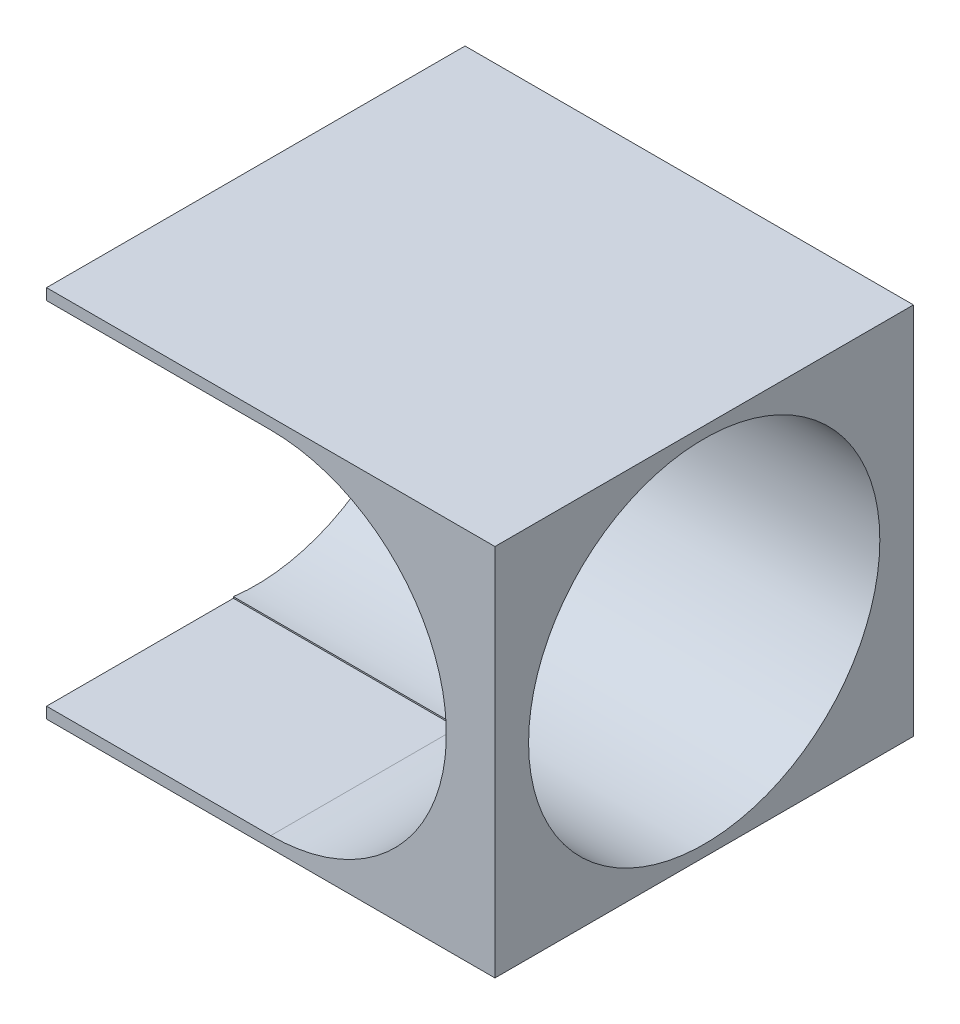
ISO-10303-21;
HEADER;
FILE_DESCRIPTION(('STEP AP214'),'2;1');
FILE_NAME('part.step','',(''),(''),'','','');
FILE_SCHEMA(('AUTOMOTIVE_DESIGN { 1 0 10303 214 1 1 1 1 }'));
ENDSEC;
DATA;
#1=APPLICATION_CONTEXT('core data for automotive mechanical design processes');
#2=APPLICATION_PROTOCOL_DEFINITION('international standard','automotive_design',2000,#1);
#3=PRODUCT_CONTEXT('',#1,'mechanical');
#4=PRODUCT('Part','Part','',(#3));
#5=PRODUCT_RELATED_PRODUCT_CATEGORY('part','',(#4));
#6=PRODUCT_DEFINITION_FORMATION('','',#4);
#7=PRODUCT_DEFINITION_CONTEXT('part definition',#1,'design');
#8=PRODUCT_DEFINITION('design','',#6,#7);
#9=PRODUCT_DEFINITION_SHAPE('','',#8);
#10=(LENGTH_UNIT() NAMED_UNIT(*) SI_UNIT(.MILLI.,.METRE.));
#11=(NAMED_UNIT(*) PLANE_ANGLE_UNIT() SI_UNIT($,.RADIAN.));
#12=(NAMED_UNIT(*) SI_UNIT($,.STERADIAN.) SOLID_ANGLE_UNIT());
#13=UNCERTAINTY_MEASURE_WITH_UNIT(LENGTH_MEASURE(1.E-05),#10,'distance_accuracy_value','');
#14=(GEOMETRIC_REPRESENTATION_CONTEXT(3) GLOBAL_UNCERTAINTY_ASSIGNED_CONTEXT((#13)) GLOBAL_UNIT_ASSIGNED_CONTEXT((#10,
#11,#12)) REPRESENTATION_CONTEXT('',''));
#15=CARTESIAN_POINT('',(0.,0.,0.));
#16=DIRECTION('',(0.,0.,1.));
#17=DIRECTION('',(1.,0.,0.));
#18=AXIS2_PLACEMENT_3D('',#15,#16,#17);
#19=CARTESIAN_POINT('',(15.,12.5,0.));
#20=DIRECTION('',(-1.,0.,0.));
#21=DIRECTION('',(0.,0.,1.));
#22=AXIS2_PLACEMENT_3D('',#19,#20,#21);
#23=CYLINDRICAL_SURFACE('',#22,11.75);
#24=CARTESIAN_POINT('',(15.,12.5,0.));
#25=DIRECTION('',(-1.,0.,0.));
#26=DIRECTION('',(0.,0.,1.));
#27=AXIS2_PLACEMENT_3D('',#24,#25,#26);
#28=CIRCLE('',#27,11.75);
#29=CARTESIAN_POINT('',(15.,12.5,11.75));
#30=VERTEX_POINT('',#29);
#31=EDGE_CURVE('E185',#30,#30,#28,.T.);
#32=ORIENTED_EDGE('',*,*,#31,.F.);
#33=EDGE_LOOP('',(#32));
#34=FACE_BOUND('',#33,.T.);
#35=DIRECTION('',(-1.,0.,0.));
#36=VECTOR('',#35,1.);
#37=CARTESIAN_POINT('',(15.,24.1538620208067,1.5));
#38=LINE('',#37,#36);
#39=CARTESIAN_POINT('',(-15.,24.1538620208067,1.5));
#40=VERTEX_POINT('',#39);
#41=CARTESIAN_POINT('',(1.5,24.1538620208067,1.5));
#42=VERTEX_POINT('',#41);
#43=EDGE_CURVE('E11',#40,#42,#38,.F.);
#44=ORIENTED_EDGE('',*,*,#43,.F.);
#45=CARTESIAN_POINT('',(-15.,12.5,0.));
#46=DIRECTION('',(-1.,0.,0.));
#47=DIRECTION('',(0.,0.,1.));
#48=AXIS2_PLACEMENT_3D('',#45,#46,#47);
#49=CIRCLE('',#48,11.75);
#50=CARTESIAN_POINT('',(-15.,0.846137979193336,1.5));
#51=VERTEX_POINT('',#50);
#52=EDGE_CURVE('E179',#40,#51,#49,.T.);
#53=ORIENTED_EDGE('',*,*,#52,.T.);
#54=DIRECTION('',(-1.,0.,0.));
#55=VECTOR('',#54,1.);
#56=CARTESIAN_POINT('',(15.,0.846137979193336,1.5));
#57=LINE('',#56,#55);
#58=CARTESIAN_POINT('',(1.50000000000002,0.84613797919334,1.5));
#59=VERTEX_POINT('',#58);
#60=EDGE_CURVE('E230',#59,#51,#57,.T.);
#61=ORIENTED_EDGE('',*,*,#60,.F.);
#62=CARTESIAN_POINT('',(0.,12.5,0.));
#63=DIRECTION('',(-0.707106781186547,0.,0.707106781186548));
#64=DIRECTION('',(-0.707106781186547,0.,-0.707106781186547));
#65=AXIS2_PLACEMENT_3D('',#62,#63,#64);
#66=ELLIPSE('',#65,16.6170093578839,11.75);
#67=EDGE_CURVE('E54',#59,#42,#66,.T.);
#68=ORIENTED_EDGE('',*,*,#67,.T.);
#69=EDGE_LOOP('',(#44,#53,#61,#68));
#70=FACE_BOUND('',#69,.T.);
#71=ADVANCED_FACE('F45',(#34,#70),#23,.F.);
#72=CARTESIAN_POINT('',(15.,25.,-14.));
#73=DIRECTION('',(-1.,0.,0.));
#74=DIRECTION('',(0.,0.,1.));
#75=AXIS2_PLACEMENT_3D('',#72,#73,#74);
#76=PLANE('',#75);
#77=ORIENTED_EDGE('',*,*,#31,.T.);
#78=EDGE_LOOP('',(#77));
#79=FACE_BOUND('',#78,.T.);
#80=DIRECTION('',(0.,0.,-1.));
#81=VECTOR('',#80,1.);
#82=CARTESIAN_POINT('',(15.,0.,-14.));
#83=LINE('',#82,#81);
#84=CARTESIAN_POINT('',(15.,0.,14.));
#85=VERTEX_POINT('',#84);
#86=CARTESIAN_POINT('',(15.,0.,-14.));
#87=VERTEX_POINT('',#86);
#88=EDGE_CURVE('E189',#85,#87,#83,.T.);
#89=ORIENTED_EDGE('',*,*,#88,.T.);
#90=DIRECTION('',(0.,-1.,0.));
#91=VECTOR('',#90,1.);
#92=CARTESIAN_POINT('',(15.,25.,-14.));
#93=LINE('',#92,#91);
#94=CARTESIAN_POINT('',(15.,25.,-14.));
#95=VERTEX_POINT('',#94);
#96=EDGE_CURVE('E227',#95,#87,#93,.T.);
#97=ORIENTED_EDGE('',*,*,#96,.F.);
#98=DIRECTION('',(0.,0.,-1.));
#99=VECTOR('',#98,1.);
#100=CARTESIAN_POINT('',(15.,25.,-14.));
#101=LINE('',#100,#99);
#102=CARTESIAN_POINT('',(15.,25.,14.));
#103=VERTEX_POINT('',#102);
#104=EDGE_CURVE('E193',#103,#95,#101,.T.);
#105=ORIENTED_EDGE('',*,*,#104,.F.);
#106=DIRECTION('',(0.,-1.,0.));
#107=VECTOR('',#106,1.);
#108=CARTESIAN_POINT('',(15.,25.,14.));
#109=LINE('',#108,#107);
#110=EDGE_CURVE('E203',#103,#85,#109,.T.);
#111=ORIENTED_EDGE('',*,*,#110,.T.);
#112=EDGE_LOOP('',(#89,#97,#105,#111));
#113=FACE_BOUND('',#112,.T.);
#114=ADVANCED_FACE('F47',(#79,#113),#76,.F.);
#115=CARTESIAN_POINT('',(-15.,25.,-14.));
#116=DIRECTION('',(0.,0.,1.));
#117=DIRECTION('',(1.,0.,0.));
#118=AXIS2_PLACEMENT_3D('',#115,#116,#117);
#119=PLANE('',#118);
#120=DIRECTION('',(-1.,0.,0.));
#121=VECTOR('',#120,1.);
#122=CARTESIAN_POINT('',(-15.,0.,-14.));
#123=LINE('',#122,#121);
#124=CARTESIAN_POINT('',(-15.,0.,-14.));
#125=VERTEX_POINT('',#124);
#126=EDGE_CURVE('E207',#87,#125,#123,.T.);
#127=ORIENTED_EDGE('',*,*,#126,.T.);
#128=DIRECTION('',(0.,-1.,0.));
#129=VECTOR('',#128,1.);
#130=CARTESIAN_POINT('',(-15.,25.,-14.));
#131=LINE('',#130,#129);
#132=CARTESIAN_POINT('',(-15.,25.,-14.));
#133=VERTEX_POINT('',#132);
#134=EDGE_CURVE('E223',#133,#125,#131,.T.);
#135=ORIENTED_EDGE('',*,*,#134,.F.);
#136=DIRECTION('',(-1.,0.,0.));
#137=VECTOR('',#136,1.);
#138=CARTESIAN_POINT('',(-15.,25.,-14.));
#139=LINE('',#138,#137);
#140=EDGE_CURVE('E98',#95,#133,#139,.T.);
#141=ORIENTED_EDGE('',*,*,#140,.F.);
#142=ORIENTED_EDGE('',*,*,#96,.T.);
#143=EDGE_LOOP('',(#127,#135,#141,#142));
#144=FACE_BOUND('',#143,.T.);
#145=ADVANCED_FACE('F256',(#144),#119,.F.);
#146=CARTESIAN_POINT('',(-15.,25.,-14.));
#147=DIRECTION('',(1.,0.,0.));
#148=DIRECTION('',(0.,0.,-1.));
#149=AXIS2_PLACEMENT_3D('',#146,#147,#148);
#150=PLANE('',#149);
#151=DIRECTION('',(0.,-1.,0.));
#152=VECTOR('',#151,1.);
#153=CARTESIAN_POINT('',(-15.,0.749999999999997,1.5));
#154=LINE('',#153,#152);
#155=CARTESIAN_POINT('',(-15.,24.25,1.5));
#156=VERTEX_POINT('',#155);
#157=EDGE_CURVE('E162',#156,#40,#154,.T.);
#158=ORIENTED_EDGE('',*,*,#157,.F.);
#159=DIRECTION('',(0.,0.,1.));
#160=VECTOR('',#159,1.);
#161=CARTESIAN_POINT('',(-15.,24.25,1.5));
#162=LINE('',#161,#160);
#163=CARTESIAN_POINT('',(-15.,24.25,14.));
#164=VERTEX_POINT('',#163);
#165=EDGE_CURVE('E152',#156,#164,#162,.T.);
#166=ORIENTED_EDGE('',*,*,#165,.T.);
#167=DIRECTION('',(0.,-1.,0.));
#168=VECTOR('',#167,1.);
#169=CARTESIAN_POINT('',(-15.,25.,14.));
#170=LINE('',#169,#168);
#171=CARTESIAN_POINT('',(-15.,25.,14.));
#172=VERTEX_POINT('',#171);
#173=EDGE_CURVE('E219',#172,#164,#170,.T.);
#174=ORIENTED_EDGE('',*,*,#173,.F.);
#175=DIRECTION('',(0.,0.,1.));
#176=VECTOR('',#175,1.);
#177=CARTESIAN_POINT('',(-15.,25.,-14.));
#178=LINE('',#177,#176);
#179=EDGE_CURVE('E198',#133,#172,#178,.T.);
#180=ORIENTED_EDGE('',*,*,#179,.F.);
#181=ORIENTED_EDGE('',*,*,#134,.T.);
#182=DIRECTION('',(0.,0.,1.));
#183=VECTOR('',#182,1.);
#184=CARTESIAN_POINT('',(-15.,0.,-14.));
#185=LINE('',#184,#183);
#186=CARTESIAN_POINT('',(-15.,0.,14.));
#187=VERTEX_POINT('',#186);
#188=EDGE_CURVE('E210',#125,#187,#185,.T.);
#189=ORIENTED_EDGE('',*,*,#188,.T.);
#190=CARTESIAN_POINT('',(-15.,0.749999999999997,14.));
#191=VERTEX_POINT('',#190);
#192=EDGE_CURVE('E218',#191,#187,#170,.T.);
#193=ORIENTED_EDGE('',*,*,#192,.F.);
#194=DIRECTION('',(0.,0.,1.));
#195=VECTOR('',#194,1.);
#196=CARTESIAN_POINT('',(-15.,0.749999999999997,1.5));
#197=LINE('',#196,#195);
#198=CARTESIAN_POINT('',(-15.,0.749999999999997,1.5));
#199=VERTEX_POINT('',#198);
#200=EDGE_CURVE('E180',#199,#191,#197,.T.);
#201=ORIENTED_EDGE('',*,*,#200,.F.);
#202=EDGE_CURVE('E158',#51,#199,#154,.T.);
#203=ORIENTED_EDGE('',*,*,#202,.F.);
#204=ORIENTED_EDGE('',*,*,#52,.F.);
#205=EDGE_LOOP('',(#158,#166,#174,#180,#181,#189,#193,#201,#203,#204));
#206=FACE_BOUND('',#205,.T.);
#207=ADVANCED_FACE('F245',(#206),#150,.F.);
#208=CARTESIAN_POINT('',(-15.,25.,14.));
#209=DIRECTION('',(0.,0.,-1.));
#210=DIRECTION('',(-1.,0.,0.));
#211=AXIS2_PLACEMENT_3D('',#208,#209,#210);
#212=PLANE('',#211);
#213=CARTESIAN_POINT('',(0.,12.5,14.));
#214=DIRECTION('',(0.,0.,1.));
#215=DIRECTION('',(1.,0.,0.));
#216=AXIS2_PLACEMENT_3D('',#213,#214,#215);
#217=CIRCLE('',#216,11.75);
#218=CARTESIAN_POINT('',(0.,0.749999999999999,14.));
#219=VERTEX_POINT('',#218);
#220=CARTESIAN_POINT('',(0.,24.25,14.));
#221=VERTEX_POINT('',#220);
#222=EDGE_CURVE('E148',#219,#221,#217,.T.);
#223=ORIENTED_EDGE('',*,*,#222,.F.);
#224=DIRECTION('',(1.,0.,0.));
#225=VECTOR('',#224,1.);
#226=CARTESIAN_POINT('',(0.,0.749999999999999,14.));
#227=LINE('',#226,#225);
#228=EDGE_CURVE('E142',#191,#219,#227,.T.);
#229=ORIENTED_EDGE('',*,*,#228,.F.);
#230=ORIENTED_EDGE('',*,*,#192,.T.);
#231=DIRECTION('',(1.,0.,0.));
#232=VECTOR('',#231,1.);
#233=CARTESIAN_POINT('',(-15.,0.,14.));
#234=LINE('',#233,#232);
#235=EDGE_CURVE('E90',#187,#85,#234,.T.);
#236=ORIENTED_EDGE('',*,*,#235,.T.);
#237=ORIENTED_EDGE('',*,*,#110,.F.);
#238=DIRECTION('',(1.,0.,0.));
#239=VECTOR('',#238,1.);
#240=CARTESIAN_POINT('',(-15.,25.,14.));
#241=LINE('',#240,#239);
#242=EDGE_CURVE('E70',#172,#103,#241,.T.);
#243=ORIENTED_EDGE('',*,*,#242,.F.);
#244=ORIENTED_EDGE('',*,*,#173,.T.);
#245=DIRECTION('',(-1.,0.,0.));
#246=VECTOR('',#245,1.);
#247=CARTESIAN_POINT('',(0.,24.25,14.));
#248=LINE('',#247,#246);
#249=EDGE_CURVE('E170',#221,#164,#248,.T.);
#250=ORIENTED_EDGE('',*,*,#249,.F.);
#251=EDGE_LOOP('',(#223,#229,#230,#236,#237,#243,#244,#250));
#252=FACE_BOUND('',#251,.T.);
#253=ADVANCED_FACE('F248',(#252),#212,.F.);
#254=CARTESIAN_POINT('',(0.,25.,0.));
#255=DIRECTION('',(0.,1.,0.));
#256=DIRECTION('',(0.,0.,1.));
#257=AXIS2_PLACEMENT_3D('',#254,#255,#256);
#258=PLANE('',#257);
#259=ORIENTED_EDGE('',*,*,#104,.T.);
#260=ORIENTED_EDGE('',*,*,#140,.T.);
#261=ORIENTED_EDGE('',*,*,#179,.T.);
#262=ORIENTED_EDGE('',*,*,#242,.T.);
#263=EDGE_LOOP('',(#259,#260,#261,#262));
#264=FACE_BOUND('',#263,.T.);
#265=ADVANCED_FACE('F255',(#264),#258,.T.);
#266=CARTESIAN_POINT('',(0.,0.,0.));
#267=DIRECTION('',(0.,1.,0.));
#268=DIRECTION('',(0.,0.,1.));
#269=AXIS2_PLACEMENT_3D('',#266,#267,#268);
#270=PLANE('',#269);
#271=ORIENTED_EDGE('',*,*,#88,.F.);
#272=ORIENTED_EDGE('',*,*,#235,.F.);
#273=ORIENTED_EDGE('',*,*,#188,.F.);
#274=ORIENTED_EDGE('',*,*,#126,.F.);
#275=EDGE_LOOP('',(#271,#272,#273,#274));
#276=FACE_BOUND('',#275,.T.);
#277=ADVANCED_FACE('F258',(#276),#270,.F.);
#278=CARTESIAN_POINT('',(0.,12.5,1.5));
#279=DIRECTION('',(0.,0.,1.));
#280=DIRECTION('',(1.,0.,0.));
#281=AXIS2_PLACEMENT_3D('',#278,#279,#280);
#282=CYLINDRICAL_SURFACE('',#281,11.75);
#283=CARTESIAN_POINT('',(0.,12.5,1.5));
#284=DIRECTION('',(0.,0.,1.));
#285=DIRECTION('',(1.,0.,0.));
#286=AXIS2_PLACEMENT_3D('',#283,#284,#285);
#287=CIRCLE('',#286,11.75);
#288=CARTESIAN_POINT('',(0.,0.749999999999999,1.5));
#289=VERTEX_POINT('',#288);
#290=EDGE_CURVE('E61',#289,#59,#287,.T.);
#291=ORIENTED_EDGE('',*,*,#290,.F.);
#292=DIRECTION('',(0.,0.,1.));
#293=VECTOR('',#292,1.);
#294=CARTESIAN_POINT('',(0.,0.749999999999999,1.5));
#295=LINE('',#294,#293);
#296=EDGE_CURVE('E176',#289,#219,#295,.T.);
#297=ORIENTED_EDGE('',*,*,#296,.T.);
#298=ORIENTED_EDGE('',*,*,#222,.T.);
#299=DIRECTION('',(0.,0.,1.));
#300=VECTOR('',#299,1.);
#301=CARTESIAN_POINT('',(0.,24.25,1.5));
#302=LINE('',#301,#300);
#303=CARTESIAN_POINT('',(0.,24.25,1.5));
#304=VERTEX_POINT('',#303);
#305=EDGE_CURVE('E145',#304,#221,#302,.T.);
#306=ORIENTED_EDGE('',*,*,#305,.F.);
#307=EDGE_CURVE('E132',#42,#304,#287,.T.);
#308=ORIENTED_EDGE('',*,*,#307,.F.);
#309=ORIENTED_EDGE('',*,*,#67,.F.);
#310=EDGE_LOOP('',(#291,#297,#298,#306,#308,#309));
#311=FACE_BOUND('',#310,.T.);
#312=ADVANCED_FACE('F146',(#311),#282,.F.);
#313=CARTESIAN_POINT('',(0.,12.5,1.5));
#314=DIRECTION('',(0.,0.,1.));
#315=DIRECTION('',(1.,0.,0.));
#316=AXIS2_PLACEMENT_3D('',#313,#314,#315);
#317=PLANE('',#316);
#318=ORIENTED_EDGE('',*,*,#43,.T.);
#319=ORIENTED_EDGE('',*,*,#307,.T.);
#320=DIRECTION('',(-1.,0.,0.));
#321=VECTOR('',#320,1.);
#322=CARTESIAN_POINT('',(0.,24.25,1.5));
#323=LINE('',#322,#321);
#324=EDGE_CURVE('E136',#304,#156,#323,.T.);
#325=ORIENTED_EDGE('',*,*,#324,.T.);
#326=ORIENTED_EDGE('',*,*,#157,.T.);
#327=EDGE_LOOP('',(#318,#319,#325,#326));
#328=FACE_BOUND('',#327,.T.);
#329=ADVANCED_FACE('F134',(#328),#317,.T.);
#330=ORIENTED_EDGE('',*,*,#60,.T.);
#331=ORIENTED_EDGE('',*,*,#202,.T.);
#332=DIRECTION('',(1.,0.,0.));
#333=VECTOR('',#332,1.);
#334=CARTESIAN_POINT('',(0.,0.749999999999999,1.5));
#335=LINE('',#334,#333);
#336=EDGE_CURVE('E153',#199,#289,#335,.T.);
#337=ORIENTED_EDGE('',*,*,#336,.T.);
#338=ORIENTED_EDGE('',*,*,#290,.T.);
#339=EDGE_LOOP('',(#330,#331,#337,#338));
#340=FACE_BOUND('',#339,.T.);
#341=ADVANCED_FACE('F237',(#340),#317,.T.);
#342=CARTESIAN_POINT('',(0.,0.749999999999999,1.5));
#343=DIRECTION('',(0.,-1.,0.));
#344=DIRECTION('',(1.,0.,0.));
#345=AXIS2_PLACEMENT_3D('',#342,#343,#344);
#346=PLANE('',#345);
#347=ORIENTED_EDGE('',*,*,#228,.T.);
#348=ORIENTED_EDGE('',*,*,#296,.F.);
#349=ORIENTED_EDGE('',*,*,#336,.F.);
#350=ORIENTED_EDGE('',*,*,#200,.T.);
#351=EDGE_LOOP('',(#347,#348,#349,#350));
#352=FACE_BOUND('',#351,.T.);
#353=ADVANCED_FACE('F241',(#352),#346,.F.);
#354=CARTESIAN_POINT('',(0.,24.25,1.5));
#355=DIRECTION('',(0.,1.,0.));
#356=DIRECTION('',(-1.,0.,0.));
#357=AXIS2_PLACEMENT_3D('',#354,#355,#356);
#358=PLANE('',#357);
#359=ORIENTED_EDGE('',*,*,#249,.T.);
#360=ORIENTED_EDGE('',*,*,#165,.F.);
#361=ORIENTED_EDGE('',*,*,#324,.F.);
#362=ORIENTED_EDGE('',*,*,#305,.T.);
#363=EDGE_LOOP('',(#359,#360,#361,#362));
#364=FACE_BOUND('',#363,.T.);
#365=ADVANCED_FACE('F155',(#364),#358,.F.);
#366=CLOSED_SHELL('',(#71,#114,#145,#207,#253,#265,#277,#312,#329,#341,#353,#365));
#367=MANIFOLD_SOLID_BREP('B2',#366);
#368=ADVANCED_BREP_SHAPE_REPRESENTATION('',(#18,#367),#14);
#369=SHAPE_DEFINITION_REPRESENTATION(#9,#368);
ENDSEC;
END-ISO-10303-21;
